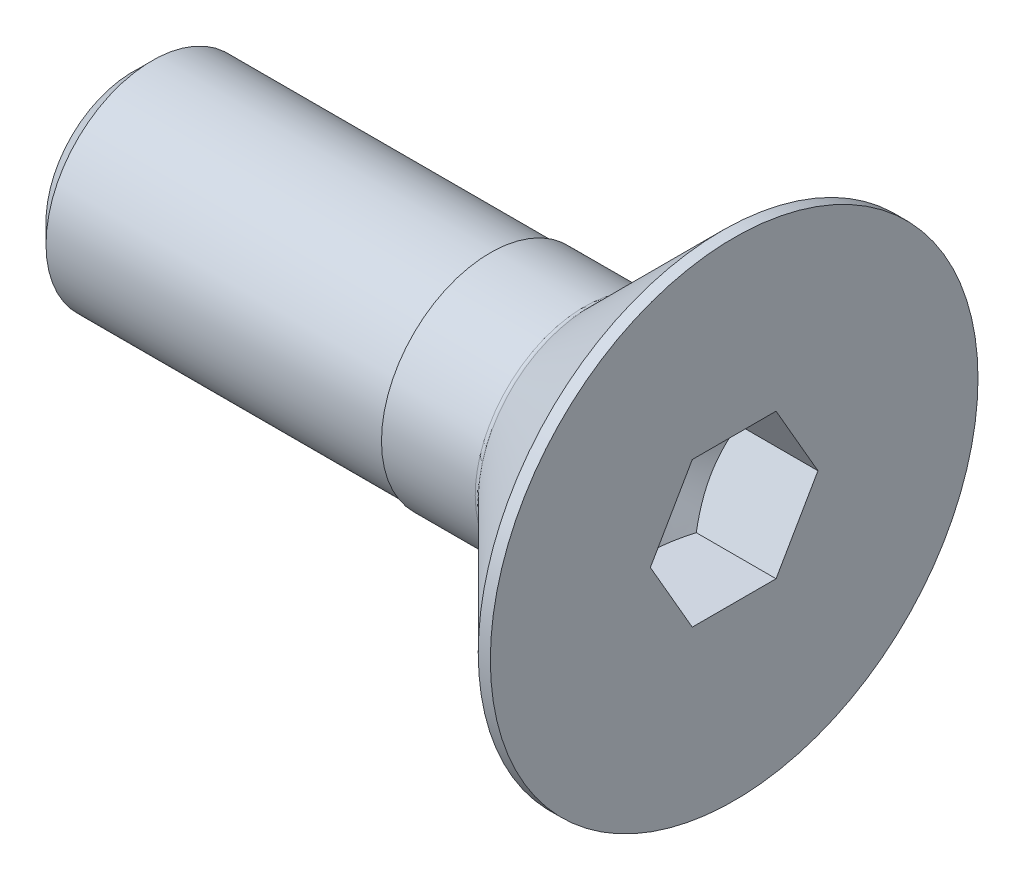
ISO-10303-21;
HEADER;
FILE_DESCRIPTION(('STEP AP214'),'2;1');
FILE_NAME('part.step','',(''),(''),'','','');
FILE_SCHEMA(('AUTOMOTIVE_DESIGN { 1 0 10303 214 1 1 1 1 }'));
ENDSEC;
DATA;
#1=APPLICATION_CONTEXT('core data for automotive mechanical design processes');
#2=APPLICATION_PROTOCOL_DEFINITION('international standard','automotive_design',2000,#1);
#3=PRODUCT_CONTEXT('',#1,'mechanical');
#4=PRODUCT('Part','Part','',(#3));
#5=PRODUCT_RELATED_PRODUCT_CATEGORY('part','',(#4));
#6=PRODUCT_DEFINITION_FORMATION('','',#4);
#7=PRODUCT_DEFINITION_CONTEXT('part definition',#1,'design');
#8=PRODUCT_DEFINITION('design','',#6,#7);
#9=PRODUCT_DEFINITION_SHAPE('','',#8);
#10=(LENGTH_UNIT() NAMED_UNIT(*) SI_UNIT(.MILLI.,.METRE.));
#11=(NAMED_UNIT(*) PLANE_ANGLE_UNIT() SI_UNIT($,.RADIAN.));
#12=(NAMED_UNIT(*) SI_UNIT($,.STERADIAN.) SOLID_ANGLE_UNIT());
#13=UNCERTAINTY_MEASURE_WITH_UNIT(LENGTH_MEASURE(1.E-05),#10,'distance_accuracy_value','');
#14=(GEOMETRIC_REPRESENTATION_CONTEXT(3) GLOBAL_UNCERTAINTY_ASSIGNED_CONTEXT((#13)) GLOBAL_UNIT_ASSIGNED_CONTEXT((#10,
#11,#12)) REPRESENTATION_CONTEXT('',''));
#15=CARTESIAN_POINT('',(0.,0.,0.));
#16=DIRECTION('',(0.,0.,1.));
#17=DIRECTION('',(1.,0.,0.));
#18=AXIS2_PLACEMENT_3D('',#15,#16,#17);
#19=CARTESIAN_POINT('',(-8.29,0.,1.19276463415));
#20=DIRECTION('',(-1.,0.,0.));
#21=DIRECTION('',(0.,0.,1.));
#22=AXIS2_PLACEMENT_3D('',#19,#20,#21);
#23=PLANE('',#22);
#24=CARTESIAN_POINT('',(-8.28999999998814,0.,0.));
#25=DIRECTION('',(1.,0.,0.));
#26=DIRECTION('',(0.,0.,-1.));
#27=AXIS2_PLACEMENT_3D('',#24,#25,#26);
#28=CIRCLE('',#27,1.19276463422334);
#29=CARTESIAN_POINT('',(-8.28999999998814,0.,-1.19276463422334));
#30=VERTEX_POINT('',#29);
#31=EDGE_CURVE('E19',#30,#30,#28,.T.);
#32=ORIENTED_EDGE('',*,*,#31,.F.);
#33=EDGE_LOOP('',(#32));
#34=FACE_BOUND('',#33,.T.);
#35=ADVANCED_FACE('F16',(#34),#23,.T.);
#36=CARTESIAN_POINT('',(-8.01935000009735,0.,0.));
#37=DIRECTION('',(1.,0.,0.));
#38=DIRECTION('',(0.,0.,-1.));
#39=AXIS2_PLACEMENT_3D('',#36,#37,#38);
#40=CONICAL_SURFACE('',#39,1.46341463407753,0.78539816332983);
#41=CARTESIAN_POINT('',(-8.01935,0.,0.));
#42=DIRECTION('',(-1.,0.,0.));
#43=DIRECTION('',(0.,0.,1.));
#44=AXIS2_PLACEMENT_3D('',#41,#42,#43);
#45=CIRCLE('',#44,1.46341463415);
#46=CARTESIAN_POINT('',(-8.01935,0.,1.46341463415));
#47=VERTEX_POINT('',#46);
#48=EDGE_CURVE('E233',#47,#47,#45,.F.);
#49=ORIENTED_EDGE('',*,*,#48,.F.);
#50=EDGE_LOOP('',(#49));
#51=FACE_BOUND('',#50,.T.);
#52=ORIENTED_EDGE('',*,*,#31,.T.);
#53=EDGE_LOOP('',(#52));
#54=FACE_BOUND('',#53,.T.);
#55=ADVANCED_FACE('F147',(#51,#54),#40,.T.);
#56=CARTESIAN_POINT('',(-4.145,0.,0.));
#57=DIRECTION('',(-1.,0.,0.));
#58=DIRECTION('',(0.,0.,1.));
#59=AXIS2_PLACEMENT_3D('',#56,#57,#58);
#60=CYLINDRICAL_SURFACE('',#59,1.46341463415);
#61=CARTESIAN_POINT('',(-3.36,0.,0.));
#62=DIRECTION('',(-1.,0.,0.));
#63=DIRECTION('',(0.,0.,1.));
#64=AXIS2_PLACEMENT_3D('',#61,#62,#63);
#65=CIRCLE('',#64,1.46341463415);
#66=CARTESIAN_POINT('',(-3.36,0.,1.46341463415));
#67=VERTEX_POINT('',#66);
#68=EDGE_CURVE('E231',#67,#67,#65,.F.);
#69=ORIENTED_EDGE('',*,*,#68,.F.);
#70=EDGE_LOOP('',(#69));
#71=FACE_BOUND('',#70,.T.);
#72=ORIENTED_EDGE('',*,*,#48,.T.);
#73=EDGE_LOOP('',(#72));
#74=FACE_BOUND('',#73,.T.);
#75=ADVANCED_FACE('F144',(#71,#74),#60,.T.);
#76=CARTESIAN_POINT('',(-3.36,0.,1.5));
#77=DIRECTION('',(-1.,0.,0.));
#78=DIRECTION('',(0.,0.,1.));
#79=AXIS2_PLACEMENT_3D('',#76,#77,#78);
#80=PLANE('',#79);
#81=ORIENTED_EDGE('',*,*,#68,.T.);
#82=EDGE_LOOP('',(#81));
#83=FACE_BOUND('',#82,.T.);
#84=CARTESIAN_POINT('',(-3.36,0.,0.));
#85=DIRECTION('',(-1.,0.,0.));
#86=DIRECTION('',(0.,0.,1.));
#87=AXIS2_PLACEMENT_3D('',#84,#85,#86);
#88=CIRCLE('',#87,1.5);
#89=CARTESIAN_POINT('',(-3.36,0.,1.5));
#90=VERTEX_POINT('',#89);
#91=EDGE_CURVE('E228',#90,#90,#88,.F.);
#92=ORIENTED_EDGE('',*,*,#91,.F.);
#93=EDGE_LOOP('',(#92));
#94=FACE_BOUND('',#93,.T.);
#95=ADVANCED_FACE('F140',(#83,#94),#80,.T.);
#96=CARTESIAN_POINT('',(-4.145,0.,0.));
#97=DIRECTION('',(-1.,0.,0.));
#98=DIRECTION('',(0.,0.,1.));
#99=AXIS2_PLACEMENT_3D('',#96,#97,#98);
#100=CYLINDRICAL_SURFACE('',#99,1.5);
#101=ORIENTED_EDGE('',*,*,#91,.T.);
#102=EDGE_LOOP('',(#101));
#103=FACE_BOUND('',#102,.T.);
#104=CARTESIAN_POINT('',(-2.0680880229,0.,0.));
#105=DIRECTION('',(-1.,0.,0.));
#106=DIRECTION('',(0.,0.479425538604203,0.877582561890372));
#107=AXIS2_PLACEMENT_3D('',#104,#105,#106);
#108=CIRCLE('',#107,1.5);
#109=CARTESIAN_POINT('',(-2.0680880229,0.719138307906305,1.31637384283556));
#110=VERTEX_POINT('',#109);
#111=EDGE_CURVE('E230',#110,#110,#108,.T.);
#112=ORIENTED_EDGE('',*,*,#111,.T.);
#113=EDGE_LOOP('',(#112));
#114=FACE_BOUND('',#113,.T.);
#115=ADVANCED_FACE('F135',(#103,#114),#100,.T.);
#116=CARTESIAN_POINT('',(-2.0680880229,0.,0.));
#117=DIRECTION('',(-1.,0.,0.));
#118=DIRECTION('',(0.,0.479425538604204,0.877582561890373));
#119=AXIS2_PLACEMENT_3D('',#116,#117,#118);
#120=TOROIDAL_SURFACE('',#119,1.6,0.1);
#121=CARTESIAN_POINT('',(-1.99737734476457,0.,0.));
#122=DIRECTION('',(1.,0.,0.));
#123=DIRECTION('',(0.,0.479425538607359,0.877582561888649));
#124=AXIS2_PLACEMENT_3D('',#121,#122,#123);
#125=CIRCLE('',#124,1.52928932188669);
#126=CARTESIAN_POINT('',(-1.99737734476457,0.733180356832008,1.34207764097027));
#127=VERTEX_POINT('',#126);
#128=EDGE_CURVE('E125',#127,#127,#125,.T.);
#129=ORIENTED_EDGE('',*,*,#128,.F.);
#130=EDGE_LOOP('',(#129));
#131=FACE_BOUND('',#130,.T.);
#132=ORIENTED_EDGE('',*,*,#111,.F.);
#133=EDGE_LOOP('',(#132));
#134=FACE_BOUND('',#133,.T.);
#135=ADVANCED_FACE('F130',(#131,#134),#120,.F.);
#136=CARTESIAN_POINT('',(-0.166666666700621,0.,0.));
#137=DIRECTION('',(1.,0.,0.));
#138=DIRECTION('',(0.,0.,-1.));
#139=AXIS2_PLACEMENT_3D('',#136,#137,#138);
#140=CONICAL_SURFACE('',#139,3.35999999996058,0.785398163400163);
#141=CARTESIAN_POINT('',(-0.166666666667,0.,0.));
#142=DIRECTION('',(-1.,0.,0.));
#143=DIRECTION('',(0.,0.,1.));
#144=AXIS2_PLACEMENT_3D('',#141,#142,#143);
#145=CIRCLE('',#144,3.36);
#146=CARTESIAN_POINT('',(-0.166666666667,0.,3.36));
#147=VERTEX_POINT('',#146);
#148=EDGE_CURVE('E80',#147,#147,#145,.F.);
#149=ORIENTED_EDGE('',*,*,#148,.F.);
#150=EDGE_LOOP('',(#149));
#151=FACE_BOUND('',#150,.T.);
#152=ORIENTED_EDGE('',*,*,#128,.T.);
#153=EDGE_LOOP('',(#152));
#154=FACE_BOUND('',#153,.T.);
#155=ADVANCED_FACE('F134',(#151,#154),#140,.T.);
#156=CARTESIAN_POINT('',(-1.09600000001819,0.,0.));
#157=DIRECTION('',(1.,0.,0.));
#158=DIRECTION('',(0.,0.,-1.));
#159=AXIS2_PLACEMENT_3D('',#156,#157,#158);
#160=CONICAL_SURFACE('',#159,1.16162874148765,1.04719755109602);
#161=CARTESIAN_POINT('',(-1.76666666666847,0.,2.84216946752132E-11));
#162=VERTEX_POINT('',#161);
#163=VERTEX_LOOP('',#162);
#164=FACE_BOUND('',#163,.T.);
#165=CARTESIAN_POINT('',(-1.09999999995812,-1.52248729367635E-11,-1.15470053838218));
#166=CARTESIAN_POINT('',(-1.11312715888699,-0.0393804428613141,-1.13196422909692));
#167=CARTESIAN_POINT('',(-1.12519089977936,-0.0790567429895447,-1.10905710653461));
#168=CARTESIAN_POINT('',(-1.14665914838054,-0.159027789021312,-1.0628858015788));
#169=CARTESIAN_POINT('',(-1.15605807499182,-0.199323649251595,-1.03962097582848));
#170=CARTESIAN_POINT('',(-1.17143119690234,-0.279489582892854,-0.993337152461063));
#171=CARTESIAN_POINT('',(-1.17747729586176,-0.319349018349472,-0.970324296669819));
#172=CARTESIAN_POINT('',(-1.18602252066559,-0.399317492319134,-0.924154476697718));
#173=CARTESIAN_POINT('',(-1.18852517442728,-0.439426242581172,-0.900997678938655));
#174=CARTESIAN_POINT('',(-1.18983822272469,-0.523015243439737,-0.852737546791836));
#175=CARTESIAN_POINT('',(-1.18832570398332,-0.566499646082735,-0.827631815218673));
#176=CARTESIAN_POINT('',(-1.18105124825807,-0.653244610438967,-0.777549586695502));
#177=CARTESIAN_POINT('',(-1.17528433126878,-0.696504849945739,-0.752573275771484));
#178=CARTESIAN_POINT('',(-1.15981466541017,-0.783571845573767,-0.702305122408445));
#179=CARTESIAN_POINT('',(-1.1500181442246,-0.827365675057883,-0.677020743166842));
#180=CARTESIAN_POINT('',(-1.12722690814064,-0.914223822098452,-0.62687316859145));
#181=CARTESIAN_POINT('',(-1.11423968912347,-0.957289600191912,-0.602009130016228));
#182=CARTESIAN_POINT('',(-1.0999999999521,-0.999999999989658,-0.577350269195971));
#183=B_SPLINE_CURVE_WITH_KNOTS('',3,(#165,#166,#167,#168,#169,#170,#171,#172,#173,#174,#175,
#176,#177,#178,#179,#180,#181,#182),.UNSPECIFIED.,.F.,.F.,(4,2,2,2,2,2,2,2,4),(0.,
0.142025966231467,0.284347225904518,0.423484957851745,0.562484064144726,0.712993529116992,
0.863679453741328,1.0180904413501,1.1721420842688),.UNSPECIFIED.);
#184=CARTESIAN_POINT('',(-1.09999999995232,0.,-1.15470053837308));
#185=VERTEX_POINT('',#184);
#186=CARTESIAN_POINT('',(-1.0999999999526,-0.999999999994075,-0.577350269186579));
#187=VERTEX_POINT('',#186);
#188=EDGE_CURVE('E183',#185,#187,#183,.T.);
#189=ORIENTED_EDGE('',*,*,#188,.F.);
#190=CARTESIAN_POINT('',(-1.0999999999583,0.99999999999435,-0.577350269204291));
#191=CARTESIAN_POINT('',(-1.11465222739449,0.956056056208716,-0.602721316971178));
#192=CARTESIAN_POINT('',(-1.12797766140911,0.911732788927623,-0.628311367264416));
#193=CARTESIAN_POINT('',(-1.15123680626298,0.822318826642765,-0.679934542456806));
#194=CARTESIAN_POINT('',(-1.16116228979655,0.777226543443093,-0.705968584301301));
#195=CARTESIAN_POINT('',(-1.1766120204957,0.687600783104795,-0.75771404115952));
#196=CARTESIAN_POINT('',(-1.18223910617103,0.643081092175279,-0.783417496701729));
#197=CARTESIAN_POINT('',(-1.18895541590465,0.553832339751117,-0.834945287938538));
#198=CARTESIAN_POINT('',(-1.19005020298242,0.509103602428835,-0.860769436472137));
#199=CARTESIAN_POINT('',(-1.18776685489041,0.425532755128375,-0.909019087657521));
#200=CARTESIAN_POINT('',(-1.18494935735872,0.386678104663713,-0.931451830562562));
#201=CARTESIAN_POINT('',(-1.17602134960554,0.309221929108135,-0.976171174369988));
#202=CARTESIAN_POINT('',(-1.16990779257903,0.270620671717491,-0.998457620715549));
#203=CARTESIAN_POINT('',(-1.15462508329135,0.1930049291356,-1.04326909058858));
#204=CARTESIAN_POINT('',(-1.14539117884976,0.15400026230851,-1.06578844548086));
#205=CARTESIAN_POINT('',(-1.12443411953584,0.0765725150028697,-1.11049137623054));
#206=CARTESIAN_POINT('',(-1.11271588557762,0.0381484433505674,-1.13267552434237));
#207=CARTESIAN_POINT('',(-1.09999999995187,1.06257408786546E-11,-1.15470053837387));
#208=B_SPLINE_CURVE_WITH_KNOTS('',3,(#190,#191,#192,#193,#194,#195,#196,#197,#198,#199,#200,
#201,#202,#203,#204,#205,#206,#207),.UNSPECIFIED.,.F.,.F.,(4,2,2,2,2,2,2,2,4),(0.,
0.158508005781989,0.317396908521067,0.472353803086353,0.627120444460997,0.761853891319933,
0.896712096893176,1.03456081123307,1.17213898673882),.UNSPECIFIED.);
#209=CARTESIAN_POINT('',(-1.0999999999506,1.00000000000002,-0.577350269183206));
#210=VERTEX_POINT('',#209);
#211=EDGE_CURVE('E74',#210,#185,#208,.T.);
#212=ORIENTED_EDGE('',*,*,#211,.F.);
#213=CARTESIAN_POINT('',(-1.09999999995834,1.00000000000949,0.577350269177972));
#214=CARTESIAN_POINT('',(-1.11465222739454,1.00000000000341,0.526608173633702));
#215=CARTESIAN_POINT('',(-1.12797766140918,1.00000000000091,0.475428073042938));
#216=CARTESIAN_POINT('',(-1.15123680626309,0.999999999999084,0.372181722655048));
#217=CARTESIAN_POINT('',(-1.16116228979669,0.999999999999758,0.32011363896725));
#218=CARTESIAN_POINT('',(-1.17661202049589,1.00000000000024,0.216622725251694));
#219=CARTESIAN_POINT('',(-1.18223910617124,1.00000000000006,0.165215814167004));
#220=CARTESIAN_POINT('',(-1.18895541590492,0.999999999999937,0.0621602316932202));
#221=CARTESIAN_POINT('',(-1.19005020298272,0.999999999999984,0.0105119346261284));
#222=CARTESIAN_POINT('',(-1.18776685489075,1.00000000000001,-0.0859873677446119));
#223=CARTESIAN_POINT('',(-1.18494935735907,1.,-0.13085285355476));
#224=CARTESIAN_POINT('',(-1.17602134960592,0.999999999999996,-0.220291541169721));
#225=CARTESIAN_POINT('',(-1.1699077925794,0.999999999999999,-0.264864433860887));
#226=CARTESIAN_POINT('',(-1.15462508329172,1.,-0.354487373607047));
#227=CARTESIAN_POINT('',(-1.14539117885012,1.,-0.399526083391664));
#228=CARTESIAN_POINT('',(-1.12443411953617,0.999999999999999,-0.488931944891124));
#229=CARTESIAN_POINT('',(-1.11271588557793,0.999999999999999,-0.533300241114831));
#230=CARTESIAN_POINT('',(-1.09999999995215,1.,-0.577350269177862));
#231=B_SPLINE_CURVE_WITH_KNOTS('',3,(#213,#214,#215,#216,#217,#218,#219,#220,#221,#222,#223,
#224,#225,#226,#227,#228,#229,#230),.UNSPECIFIED.,.F.,.F.,(4,2,2,2,2,2,2,2,4),(0.,
0.158508005781979,0.317396908521048,0.47235380308632,0.62712044446095,0.761853891320078,
0.896712096893514,1.03456081123361,1.17213898673956),.UNSPECIFIED.);
#232=CARTESIAN_POINT('',(-1.0999999999526,0.999999999994075,0.577350269186579));
#233=VERTEX_POINT('',#232);
#234=EDGE_CURVE('E69',#233,#210,#231,.T.);
#235=ORIENTED_EDGE('',*,*,#234,.F.);
#236=CARTESIAN_POINT('',(-1.09999999995812,1.52198169908239E-11,1.15470053838218));
#237=CARTESIAN_POINT('',(-1.11312715888706,0.0393804428613522,1.13196422909707));
#238=CARTESIAN_POINT('',(-1.12519089977938,0.0790567429895204,1.1090571065347));
#239=CARTESIAN_POINT('',(-1.14665914838046,0.159027789021118,1.06288580157883));
#240=CARTESIAN_POINT('',(-1.15605807499168,0.199323649251293,1.03962097582848));
#241=CARTESIAN_POINT('',(-1.17143119690237,0.279489582892585,0.993337152461382));
#242=CARTESIAN_POINT('',(-1.177477295862,0.319349018349339,0.970324296670465));
#243=CARTESIAN_POINT('',(-1.18602252066528,0.399317492318483,0.924154476697525));
#244=CARTESIAN_POINT('',(-1.18852517442621,0.439426242579868,0.900997678937297));
#245=CARTESIAN_POINT('',(-1.18983822272356,0.523015243438452,0.85273754679032));
#246=CARTESIAN_POINT('',(-1.18832570398303,0.56649964608223,0.827631815218355));
#247=CARTESIAN_POINT('',(-1.18105124825839,0.653244610439087,0.777549586696042));
#248=CARTESIAN_POINT('',(-1.17528433126888,0.696504849945702,0.752573275771682));
#249=CARTESIAN_POINT('',(-1.15981466541009,0.783571845573593,0.702305122408365));
#250=CARTESIAN_POINT('',(-1.15001814422458,0.827365675057737,0.677020743166836));
#251=CARTESIAN_POINT('',(-1.12722690814071,0.914223822098412,0.626873168591563));
#252=CARTESIAN_POINT('',(-1.11423968912357,0.957289600191951,0.602009130016384));
#253=CARTESIAN_POINT('',(-1.0999999999521,0.999999999989658,0.577350269195971));
#254=B_SPLINE_CURVE_WITH_KNOTS('',3,(#236,#237,#238,#239,#240,#241,#242,#243,#244,#245,#246,
#247,#248,#249,#250,#251,#252,#253),.UNSPECIFIED.,.F.,.F.,(4,2,2,2,2,2,2,2,4),(0.,
0.142025966231369,0.284347225904167,0.423484957851284,0.562484064144231,0.712993529116699,
0.863679453741148,1.01809044134988,1.17214208426871),.UNSPECIFIED.);
#255=CARTESIAN_POINT('',(-1.09999999995232,0.,1.15470053837308));
#256=VERTEX_POINT('',#255);
#257=EDGE_CURVE('E72',#256,#233,#254,.T.);
#258=ORIENTED_EDGE('',*,*,#257,.F.);
#259=CARTESIAN_POINT('',(-1.09999999995829,-0.999999999994343,0.577350269204283));
#260=CARTESIAN_POINT('',(-1.11465222739449,-0.956056056208713,0.602721316971175));
#261=CARTESIAN_POINT('',(-1.12797766140911,-0.911732788927621,0.628311367264415));
#262=CARTESIAN_POINT('',(-1.15123680626298,-0.822318826642763,0.679934542456807));
#263=CARTESIAN_POINT('',(-1.16116228979655,-0.77722654344309,0.705968584301302));
#264=CARTESIAN_POINT('',(-1.1766120204957,-0.687600783104792,0.757714041159522));
#265=CARTESIAN_POINT('',(-1.18223910617103,-0.643081092175275,0.783417496701731));
#266=CARTESIAN_POINT('',(-1.18895541590465,-0.553832339751112,0.83494528793854));
#267=CARTESIAN_POINT('',(-1.19005020298242,-0.50910360242883,0.860769436472139));
#268=CARTESIAN_POINT('',(-1.18776685489041,-0.425532755128371,0.909019087657523));
#269=CARTESIAN_POINT('',(-1.18494935735872,-0.386678104663709,0.931451830562564));
#270=CARTESIAN_POINT('',(-1.17602134960554,-0.309221929108133,0.976171174369989));
#271=CARTESIAN_POINT('',(-1.16990779257903,-0.27062067171749,0.998457620715549));
#272=CARTESIAN_POINT('',(-1.15462508329135,-0.193004929135601,1.04326909058858));
#273=CARTESIAN_POINT('',(-1.14539117884976,-0.154000262308511,1.06578844548086));
#274=CARTESIAN_POINT('',(-1.12443411953584,-0.0765725150028724,1.11049137623054));
#275=CARTESIAN_POINT('',(-1.11271588557762,-0.038148443350571,1.13267552434237));
#276=CARTESIAN_POINT('',(-1.09999999995187,-1.06300655769164E-11,1.15470053837386));
#277=B_SPLINE_CURVE_WITH_KNOTS('',3,(#259,#260,#261,#262,#263,#264,#265,#266,#267,#268,#269,
#270,#271,#272,#273,#274,#275,#276),.UNSPECIFIED.,.F.,.F.,(4,2,2,2,2,2,2,2,4),(0.,
0.158508005781991,0.31739690852107,0.472353803086357,0.627120444461003,0.761853891319936,
0.896712096893176,1.03456081123307,1.17213898673881),.UNSPECIFIED.);
#278=CARTESIAN_POINT('',(-1.09999999995258,-0.999999999994089,0.577350269186623));
#279=VERTEX_POINT('',#278);
#280=EDGE_CURVE('E208',#279,#256,#277,.T.);
#281=ORIENTED_EDGE('',*,*,#280,.F.);
#282=CARTESIAN_POINT('',(-1.09999999995834,-1.00000000000949,-0.577350269177972));
#283=CARTESIAN_POINT('',(-1.11465222739454,-1.00000000000341,-0.526608173633702));
#284=CARTESIAN_POINT('',(-1.12797766140918,-1.00000000000091,-0.475428073042938));
#285=CARTESIAN_POINT('',(-1.15123680626309,-0.999999999999084,-0.372181722655048));
#286=CARTESIAN_POINT('',(-1.16116228979669,-0.999999999999758,-0.32011363896725));
#287=CARTESIAN_POINT('',(-1.17661202049589,-1.00000000000024,-0.216622725251694));
#288=CARTESIAN_POINT('',(-1.18223910617124,-1.00000000000006,-0.165215814167004));
#289=CARTESIAN_POINT('',(-1.18895541590492,-0.999999999999937,-0.0621602316932203));
#290=CARTESIAN_POINT('',(-1.19005020298272,-0.999999999999984,-0.0105119346261284));
#291=CARTESIAN_POINT('',(-1.18776685489075,-1.00000000000001,0.0859873677446109));
#292=CARTESIAN_POINT('',(-1.18494935735907,-1.,0.130852853554758));
#293=CARTESIAN_POINT('',(-1.17602134960592,-0.999999999999996,0.220291541169717));
#294=CARTESIAN_POINT('',(-1.1699077925794,-0.999999999999999,0.264864433860882));
#295=CARTESIAN_POINT('',(-1.15462508329172,-1.,0.35448737360704));
#296=CARTESIAN_POINT('',(-1.14539117885012,-1.,0.399526083391656));
#297=CARTESIAN_POINT('',(-1.12443411953617,-0.999999999999999,0.488931944891114));
#298=CARTESIAN_POINT('',(-1.11271588557793,-0.999999999999999,0.53330024111482));
#299=CARTESIAN_POINT('',(-1.09999999995216,-1.,0.57735026917785));
#300=B_SPLINE_CURVE_WITH_KNOTS('',3,(#282,#283,#284,#285,#286,#287,#288,#289,#290,#291,#292,
#293,#294,#295,#296,#297,#298,#299),.UNSPECIFIED.,.F.,.F.,(4,2,2,2,2,2,2,2,4),(0.,
0.158508005781979,0.317396908521048,0.47235380308632,0.62712044446095,0.761853891320075,
0.896712096893508,1.0345608112336,1.17213898673955),.UNSPECIFIED.);
#301=EDGE_CURVE('E204',#187,#279,#300,.T.);
#302=ORIENTED_EDGE('',*,*,#301,.F.);
#303=EDGE_LOOP('',(#189,#212,#235,#258,#281,#302));
#304=FACE_BOUND('',#303,.T.);
#305=ADVANCED_FACE('F71',(#164,#304),#160,.F.);
#306=CARTESIAN_POINT('',(-4.145,0.,0.));
#307=DIRECTION('',(-1.,0.,0.));
#308=DIRECTION('',(0.,0.,1.));
#309=AXIS2_PLACEMENT_3D('',#306,#307,#308);
#310=CYLINDRICAL_SURFACE('',#309,3.36);
#311=CARTESIAN_POINT('',(0.,0.,0.));
#312=DIRECTION('',(-1.,0.,0.));
#313=DIRECTION('',(0.,0.,1.));
#314=AXIS2_PLACEMENT_3D('',#311,#312,#313);
#315=CIRCLE('',#314,3.36);
#316=CARTESIAN_POINT('',(0.,0.,3.36));
#317=VERTEX_POINT('',#316);
#318=EDGE_CURVE('E108',#317,#317,#315,.T.);
#319=ORIENTED_EDGE('',*,*,#318,.T.);
#320=EDGE_LOOP('',(#319));
#321=FACE_BOUND('',#320,.T.);
#322=ORIENTED_EDGE('',*,*,#148,.T.);
#323=EDGE_LOOP('',(#322));
#324=FACE_BOUND('',#323,.T.);
#325=ADVANCED_FACE('F191',(#321,#324),#310,.T.);
#326=CARTESIAN_POINT('',(0.,1.,-0.57735026919));
#327=DIRECTION('',(0.,-1.,0.));
#328=DIRECTION('',(0.,0.,-1.));
#329=AXIS2_PLACEMENT_3D('',#326,#327,#328);
#330=PLANE('',#329);
#331=ORIENTED_EDGE('',*,*,#234,.T.);
#332=DIRECTION('',(1.,0.,0.));
#333=VECTOR('',#332,1.);
#334=CARTESIAN_POINT('',(0.,1.00000000000004,-0.577350269190061));
#335=LINE('',#334,#333);
#336=CARTESIAN_POINT('',(0.,1.00000000000002,-0.577350269190031));
#337=VERTEX_POINT('',#336);
#338=EDGE_CURVE('E181',#337,#210,#335,.F.);
#339=ORIENTED_EDGE('',*,*,#338,.F.);
#340=DIRECTION('',(0.,0.,1.));
#341=VECTOR('',#340,1.);
#342=CARTESIAN_POINT('',(0.,1.,3.36));
#343=LINE('',#342,#341);
#344=CARTESIAN_POINT('',(0.,1.,0.57735026919));
#345=VERTEX_POINT('',#344);
#346=EDGE_CURVE('E91',#337,#345,#343,.T.);
#347=ORIENTED_EDGE('',*,*,#346,.T.);
#348=DIRECTION('',(1.,0.,0.));
#349=VECTOR('',#348,1.);
#350=CARTESIAN_POINT('',(0.,1.,0.57735026919));
#351=LINE('',#350,#349);
#352=EDGE_CURVE('E79',#233,#345,#351,.T.);
#353=ORIENTED_EDGE('',*,*,#352,.F.);
#354=EDGE_LOOP('',(#331,#339,#347,#353));
#355=FACE_BOUND('',#354,.T.);
#356=ADVANCED_FACE('F90',(#355),#330,.T.);
#357=CARTESIAN_POINT('',(0.,1.,0.57735026919));
#358=DIRECTION('',(0.,-0.50000000000019,-0.866025403784329));
#359=DIRECTION('',(0.,0.866025403784329,-0.50000000000019));
#360=AXIS2_PLACEMENT_3D('',#357,#358,#359);
#361=PLANE('',#360);
#362=DIRECTION('',(1.,0.,0.));
#363=VECTOR('',#362,1.);
#364=CARTESIAN_POINT('',(0.,0.,1.15470053838));
#365=LINE('',#364,#363);
#366=CARTESIAN_POINT('',(0.,0.,1.15470053837999));
#367=VERTEX_POINT('',#366);
#368=EDGE_CURVE('E87',#256,#367,#365,.T.);
#369=ORIENTED_EDGE('',*,*,#368,.F.);
#370=ORIENTED_EDGE('',*,*,#257,.T.);
#371=ORIENTED_EDGE('',*,*,#352,.T.);
#372=DIRECTION('',(0.,-0.866025403784298,0.500000000000243));
#373=VECTOR('',#372,1.);
#374=CARTESIAN_POINT('',(0.,1.,0.57735026919));
#375=LINE('',#374,#373);
#376=EDGE_CURVE('E107',#345,#367,#375,.T.);
#377=ORIENTED_EDGE('',*,*,#376,.T.);
#378=EDGE_LOOP('',(#369,#370,#371,#377));
#379=FACE_BOUND('',#378,.T.);
#380=ADVANCED_FACE('F84',(#379),#361,.T.);
#381=CARTESIAN_POINT('',(0.,0.,1.15470053838));
#382=DIRECTION('',(0.,0.50000000000019,-0.866025403784329));
#383=DIRECTION('',(0.,0.866025403784329,0.50000000000019));
#384=AXIS2_PLACEMENT_3D('',#381,#382,#383);
#385=PLANE('',#384);
#386=DIRECTION('',(1.,0.,0.));
#387=VECTOR('',#386,1.);
#388=CARTESIAN_POINT('',(0.,-1.,0.57735026919));
#389=LINE('',#388,#387);
#390=CARTESIAN_POINT('',(0.,-1.,0.577350269190015));
#391=VERTEX_POINT('',#390);
#392=EDGE_CURVE('E213',#279,#391,#389,.T.);
#393=ORIENTED_EDGE('',*,*,#392,.F.);
#394=ORIENTED_EDGE('',*,*,#280,.T.);
#395=ORIENTED_EDGE('',*,*,#368,.T.);
#396=DIRECTION('',(0.,-0.866025403784298,-0.500000000000243));
#397=VECTOR('',#396,1.);
#398=CARTESIAN_POINT('',(0.,0.,1.15470053838));
#399=LINE('',#398,#397);
#400=EDGE_CURVE('E113',#367,#391,#399,.T.);
#401=ORIENTED_EDGE('',*,*,#400,.T.);
#402=EDGE_LOOP('',(#393,#394,#395,#401));
#403=FACE_BOUND('',#402,.T.);
#404=ADVANCED_FACE('F214',(#403),#385,.T.);
#405=CARTESIAN_POINT('',(0.,-1.,0.57735026919));
#406=DIRECTION('',(0.,1.,0.));
#407=DIRECTION('',(0.,0.,1.));
#408=AXIS2_PLACEMENT_3D('',#405,#406,#407);
#409=PLANE('',#408);
#410=DIRECTION('',(1.,0.,0.));
#411=VECTOR('',#410,1.);
#412=CARTESIAN_POINT('',(0.,-1.,-0.57735026919));
#413=LINE('',#412,#411);
#414=CARTESIAN_POINT('',(0.,-1.,-0.57735026919));
#415=VERTEX_POINT('',#414);
#416=EDGE_CURVE('E264',#187,#415,#413,.T.);
#417=ORIENTED_EDGE('',*,*,#416,.F.);
#418=ORIENTED_EDGE('',*,*,#301,.T.);
#419=ORIENTED_EDGE('',*,*,#392,.T.);
#420=DIRECTION('',(0.,0.,1.));
#421=VECTOR('',#420,1.);
#422=CARTESIAN_POINT('',(0.,-1.,3.36));
#423=LINE('',#422,#421);
#424=EDGE_CURVE('E103',#391,#415,#423,.F.);
#425=ORIENTED_EDGE('',*,*,#424,.T.);
#426=EDGE_LOOP('',(#417,#418,#419,#425));
#427=FACE_BOUND('',#426,.T.);
#428=ADVANCED_FACE('F217',(#427),#409,.T.);
#429=CARTESIAN_POINT('',(0.,-1.,-0.57735026919));
#430=DIRECTION('',(0.,0.50000000000019,0.866025403784329));
#431=DIRECTION('',(0.,-0.866025403784329,0.50000000000019));
#432=AXIS2_PLACEMENT_3D('',#429,#430,#431);
#433=PLANE('',#432);
#434=DIRECTION('',(1.,0.,0.));
#435=VECTOR('',#434,1.);
#436=CARTESIAN_POINT('',(0.,0.,-1.15470053838));
#437=LINE('',#436,#435);
#438=CARTESIAN_POINT('',(0.,0.,-1.15470053838));
#439=VERTEX_POINT('',#438);
#440=EDGE_CURVE('E33',#185,#439,#437,.T.);
#441=ORIENTED_EDGE('',*,*,#440,.F.);
#442=ORIENTED_EDGE('',*,*,#188,.T.);
#443=ORIENTED_EDGE('',*,*,#416,.T.);
#444=DIRECTION('',(0.,0.866025403784298,-0.500000000000243));
#445=VECTOR('',#444,1.);
#446=CARTESIAN_POINT('',(0.,-1.,-0.57735026919));
#447=LINE('',#446,#445);
#448=EDGE_CURVE('E25',#415,#439,#447,.T.);
#449=ORIENTED_EDGE('',*,*,#448,.T.);
#450=EDGE_LOOP('',(#441,#442,#443,#449));
#451=FACE_BOUND('',#450,.T.);
#452=ADVANCED_FACE('F167',(#451),#433,.T.);
#453=CARTESIAN_POINT('',(0.,0.,-1.15470053838));
#454=DIRECTION('',(0.,-0.50000000000019,0.866025403784329));
#455=DIRECTION('',(0.,-0.866025403784329,-0.50000000000019));
#456=AXIS2_PLACEMENT_3D('',#453,#454,#455);
#457=PLANE('',#456);
#458=ORIENTED_EDGE('',*,*,#440,.T.);
#459=DIRECTION('',(0.,0.866025403784298,0.500000000000243));
#460=VECTOR('',#459,1.);
#461=CARTESIAN_POINT('',(0.,0.,-1.15470053838));
#462=LINE('',#461,#460);
#463=EDGE_CURVE('E11',#439,#337,#462,.T.);
#464=ORIENTED_EDGE('',*,*,#463,.T.);
#465=ORIENTED_EDGE('',*,*,#338,.T.);
#466=ORIENTED_EDGE('',*,*,#211,.T.);
#467=EDGE_LOOP('',(#458,#464,#465,#466));
#468=FACE_BOUND('',#467,.T.);
#469=ADVANCED_FACE('F161',(#468),#457,.T.);
#470=CARTESIAN_POINT('',(0.,0.,3.36));
#471=DIRECTION('',(-1.,0.,0.));
#472=DIRECTION('',(0.,0.,1.));
#473=AXIS2_PLACEMENT_3D('',#470,#471,#472);
#474=PLANE('',#473);
#475=ORIENTED_EDGE('',*,*,#448,.F.);
#476=ORIENTED_EDGE('',*,*,#424,.F.);
#477=ORIENTED_EDGE('',*,*,#400,.F.);
#478=ORIENTED_EDGE('',*,*,#376,.F.);
#479=ORIENTED_EDGE('',*,*,#346,.F.);
#480=ORIENTED_EDGE('',*,*,#463,.F.);
#481=EDGE_LOOP('',(#475,#476,#477,#478,#479,#480));
#482=FACE_BOUND('',#481,.T.);
#483=ORIENTED_EDGE('',*,*,#318,.F.);
#484=EDGE_LOOP('',(#483));
#485=FACE_BOUND('',#484,.T.);
#486=ADVANCED_FACE('F159',(#482,#485),#474,.F.);
#487=CLOSED_SHELL('',(#35,#55,#75,#95,#115,#135,#155,#305,#325,#356,#380,#404,#428,#452,#469,#486));
#488=MANIFOLD_SOLID_BREP('B1',#487);
#489=ADVANCED_BREP_SHAPE_REPRESENTATION('',(#18,#488),#14);
#490=SHAPE_DEFINITION_REPRESENTATION(#9,#489);
ENDSEC;
END-ISO-10303-21;
